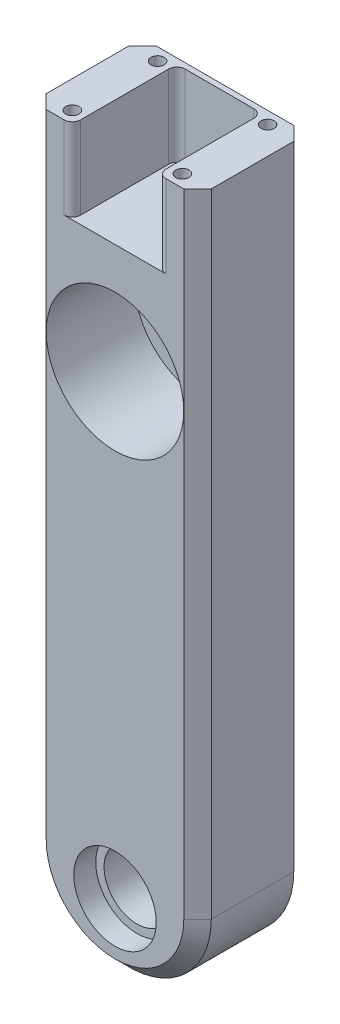
ISO-10303-21;
HEADER;
FILE_DESCRIPTION(('STEP AP214'),'2;1');
FILE_NAME('part.step','',(''),(''),'','','');
FILE_SCHEMA(('AUTOMOTIVE_DESIGN { 1 0 10303 214 1 1 1 1 }'));
ENDSEC;
DATA;
#1=APPLICATION_CONTEXT('core data for automotive mechanical design processes');
#2=APPLICATION_PROTOCOL_DEFINITION('international standard','automotive_design',2000,#1);
#3=PRODUCT_CONTEXT('',#1,'mechanical');
#4=PRODUCT('Part','Part','',(#3));
#5=PRODUCT_RELATED_PRODUCT_CATEGORY('part','',(#4));
#6=PRODUCT_DEFINITION_FORMATION('','',#4);
#7=PRODUCT_DEFINITION_CONTEXT('part definition',#1,'design');
#8=PRODUCT_DEFINITION('design','',#6,#7);
#9=PRODUCT_DEFINITION_SHAPE('','',#8);
#10=(LENGTH_UNIT() NAMED_UNIT(*) SI_UNIT(.MILLI.,.METRE.));
#11=(NAMED_UNIT(*) PLANE_ANGLE_UNIT() SI_UNIT($,.RADIAN.));
#12=(NAMED_UNIT(*) SI_UNIT($,.STERADIAN.) SOLID_ANGLE_UNIT());
#13=UNCERTAINTY_MEASURE_WITH_UNIT(LENGTH_MEASURE(1.E-05),#10,'distance_accuracy_value','');
#14=(GEOMETRIC_REPRESENTATION_CONTEXT(3) GLOBAL_UNCERTAINTY_ASSIGNED_CONTEXT((#13)) GLOBAL_UNIT_ASSIGNED_CONTEXT((#10,
#11,#12)) REPRESENTATION_CONTEXT('',''));
#15=CARTESIAN_POINT('',(0.,0.,0.));
#16=DIRECTION('',(0.,0.,1.));
#17=DIRECTION('',(1.,0.,0.));
#18=AXIS2_PLACEMENT_3D('',#15,#16,#17);
#19=CARTESIAN_POINT('',(0.,0.,10.));
#20=DIRECTION('',(0.,0.,1.));
#21=DIRECTION('',(1.,0.,0.));
#22=AXIS2_PLACEMENT_3D('',#19,#20,#21);
#23=PLANE('',#22);
#24=CARTESIAN_POINT('',(0.,0.,10.));
#25=DIRECTION('',(0.,0.,-1.));
#26=DIRECTION('',(-1.,0.,0.));
#27=AXIS2_PLACEMENT_3D('',#24,#25,#26);
#28=CIRCLE('',#27,12.5);
#29=CARTESIAN_POINT('',(-12.4999999999998,0.,10.));
#30=VERTEX_POINT('',#29);
#31=CARTESIAN_POINT('',(12.5000000000002,0.,10.));
#32=VERTEX_POINT('',#31);
#33=EDGE_CURVE('E417',#30,#32,#28,.T.);
#34=ORIENTED_EDGE('',*,*,#33,.T.);
#35=DIRECTION('',(0.,1.,0.));
#36=VECTOR('',#35,1.);
#37=CARTESIAN_POINT('',(12.5000000000002,35.,10.));
#38=LINE('',#37,#36);
#39=CARTESIAN_POINT('',(12.5000000000002,35.,10.));
#40=VERTEX_POINT('',#39);
#41=EDGE_CURVE('E338',#32,#40,#38,.T.);
#42=ORIENTED_EDGE('',*,*,#41,.T.);
#43=DIRECTION('',(1.,0.,0.));
#44=VECTOR('',#43,1.);
#45=CARTESIAN_POINT('',(15.0000000000002,35.,10.));
#46=LINE('',#45,#44);
#47=CARTESIAN_POINT('',(9.25,35.,10.));
#48=VERTEX_POINT('',#47);
#49=EDGE_CURVE('E545',#48,#40,#46,.T.);
#50=ORIENTED_EDGE('',*,*,#49,.F.);
#51=DIRECTION('',(0.,-1.,0.));
#52=VECTOR('',#51,1.);
#53=CARTESIAN_POINT('',(9.25,20.,10.));
#54=LINE('',#53,#52);
#55=CARTESIAN_POINT('',(9.25,20.,10.));
#56=VERTEX_POINT('',#55);
#57=EDGE_CURVE('E278',#48,#56,#54,.T.);
#58=ORIENTED_EDGE('',*,*,#57,.T.);
#59=DIRECTION('',(-1.,0.,0.));
#60=VECTOR('',#59,1.);
#61=CARTESIAN_POINT('',(0.,20.,10.));
#62=LINE('',#61,#60);
#63=CARTESIAN_POINT('',(-9.25,20.,10.));
#64=VERTEX_POINT('',#63);
#65=EDGE_CURVE('E255',#56,#64,#62,.T.);
#66=ORIENTED_EDGE('',*,*,#65,.T.);
#67=DIRECTION('',(0.,-1.,0.));
#68=VECTOR('',#67,1.);
#69=CARTESIAN_POINT('',(-9.25,35.,10.));
#70=LINE('',#69,#68);
#71=CARTESIAN_POINT('',(-9.25,35.,10.));
#72=VERTEX_POINT('',#71);
#73=EDGE_CURVE('E282',#64,#72,#70,.F.);
#74=ORIENTED_EDGE('',*,*,#73,.T.);
#75=DIRECTION('',(1.,0.,0.));
#76=VECTOR('',#75,1.);
#77=CARTESIAN_POINT('',(-14.9999999999998,35.,10.));
#78=LINE('',#77,#76);
#79=CARTESIAN_POINT('',(-12.4999999999998,35.,10.));
#80=VERTEX_POINT('',#79);
#81=EDGE_CURVE('E420',#80,#72,#78,.T.);
#82=ORIENTED_EDGE('',*,*,#81,.F.);
#83=DIRECTION('',(0.,-1.,0.));
#84=VECTOR('',#83,1.);
#85=CARTESIAN_POINT('',(-12.4999999999998,0.,10.));
#86=LINE('',#85,#84);
#87=EDGE_CURVE('E328',#80,#30,#86,.T.);
#88=ORIENTED_EDGE('',*,*,#87,.T.);
#89=EDGE_LOOP('',(#34,#42,#50,#58,#66,#74,#82,#88));
#90=FACE_BOUND('',#89,.T.);
#91=ADVANCED_FACE('F43',(#90),#23,.T.);
#92=CARTESIAN_POINT('',(0.,20.,10.));
#93=DIRECTION('',(0.,-1.,0.));
#94=DIRECTION('',(0.,0.,-1.));
#95=AXIS2_PLACEMENT_3D('',#92,#93,#94);
#96=PLANE('',#95);
#97=DIRECTION('',(0.,0.,1.));
#98=VECTOR('',#97,1.);
#99=CARTESIAN_POINT('',(7.75,20.,-10.));
#100=LINE('',#99,#98);
#101=CARTESIAN_POINT('',(7.75,20.,-7.5));
#102=VERTEX_POINT('',#101);
#103=CARTESIAN_POINT('',(7.75,20.,8.5));
#104=VERTEX_POINT('',#103);
#105=EDGE_CURVE('E564',#102,#104,#100,.T.);
#106=ORIENTED_EDGE('',*,*,#105,.F.);
#107=CARTESIAN_POINT('',(6.25,20.,-7.5));
#108=DIRECTION('',(0.,-1.,0.));
#109=DIRECTION('',(0.,0.,-1.));
#110=AXIS2_PLACEMENT_3D('',#107,#108,#109);
#111=CIRCLE('',#110,1.5);
#112=CARTESIAN_POINT('',(6.25,20.,-9.));
#113=VERTEX_POINT('',#112);
#114=EDGE_CURVE('E302',#102,#113,#111,.F.);
#115=ORIENTED_EDGE('',*,*,#114,.T.);
#116=DIRECTION('',(1.,0.,0.));
#117=VECTOR('',#116,1.);
#118=CARTESIAN_POINT('',(-7.75,20.,-9.));
#119=LINE('',#118,#117);
#120=CARTESIAN_POINT('',(-6.25,20.,-9.));
#121=VERTEX_POINT('',#120);
#122=EDGE_CURVE('E384',#121,#113,#119,.T.);
#123=ORIENTED_EDGE('',*,*,#122,.F.);
#124=CARTESIAN_POINT('',(-6.25,20.,-7.5));
#125=DIRECTION('',(0.,-1.,0.));
#126=DIRECTION('',(0.,0.,-1.));
#127=AXIS2_PLACEMENT_3D('',#124,#125,#126);
#128=CIRCLE('',#127,1.5);
#129=CARTESIAN_POINT('',(-7.75,20.,-7.5));
#130=VERTEX_POINT('',#129);
#131=EDGE_CURVE('E299',#121,#130,#128,.F.);
#132=ORIENTED_EDGE('',*,*,#131,.T.);
#133=DIRECTION('',(0.,0.,-1.));
#134=VECTOR('',#133,1.);
#135=CARTESIAN_POINT('',(-7.75,20.,-10.));
#136=LINE('',#135,#134);
#137=CARTESIAN_POINT('',(-7.75,20.,8.5));
#138=VERTEX_POINT('',#137);
#139=EDGE_CURVE('E424',#138,#130,#136,.T.);
#140=ORIENTED_EDGE('',*,*,#139,.F.);
#141=CARTESIAN_POINT('',(-9.25,20.,8.5));
#142=DIRECTION('',(0.,-1.,0.));
#143=DIRECTION('',(0.,0.,-1.));
#144=AXIS2_PLACEMENT_3D('',#141,#142,#143);
#145=CIRCLE('',#144,1.5);
#146=EDGE_CURVE('E312',#138,#64,#145,.T.);
#147=ORIENTED_EDGE('',*,*,#146,.T.);
#148=ORIENTED_EDGE('',*,*,#65,.F.);
#149=CARTESIAN_POINT('',(9.25,20.,8.5));
#150=DIRECTION('',(0.,-1.,0.));
#151=DIRECTION('',(0.,0.,-1.));
#152=AXIS2_PLACEMENT_3D('',#149,#150,#151);
#153=CIRCLE('',#152,1.5);
#154=EDGE_CURVE('E316',#56,#104,#153,.T.);
#155=ORIENTED_EDGE('',*,*,#154,.T.);
#156=EDGE_LOOP('',(#106,#115,#123,#132,#140,#147,#148,#155));
#157=FACE_BOUND('',#156,.T.);
#158=ADVANCED_FACE('F503',(#157),#96,.F.);
#159=CARTESIAN_POINT('',(-7.75,35.,-10.));
#160=DIRECTION('',(-1.,0.,0.));
#161=DIRECTION('',(0.,0.,1.));
#162=AXIS2_PLACEMENT_3D('',#159,#160,#161);
#163=PLANE('',#162);
#164=DIRECTION('',(0.,0.,-1.));
#165=VECTOR('',#164,1.);
#166=CARTESIAN_POINT('',(-7.75,35.,-10.));
#167=LINE('',#166,#165);
#168=CARTESIAN_POINT('',(-7.75,35.,8.5));
#169=VERTEX_POINT('',#168);
#170=CARTESIAN_POINT('',(-7.75,35.,-7.5));
#171=VERTEX_POINT('',#170);
#172=EDGE_CURVE('E412',#169,#171,#167,.T.);
#173=ORIENTED_EDGE('',*,*,#172,.F.);
#174=DIRECTION('',(0.,-1.,0.));
#175=VECTOR('',#174,1.);
#176=CARTESIAN_POINT('',(-7.75,20.,8.5));
#177=LINE('',#176,#175);
#178=EDGE_CURVE('E274',#169,#138,#177,.T.);
#179=ORIENTED_EDGE('',*,*,#178,.T.);
#180=ORIENTED_EDGE('',*,*,#139,.T.);
#181=DIRECTION('',(0.,-1.,0.));
#182=VECTOR('',#181,1.);
#183=CARTESIAN_POINT('',(-7.75,35.,-7.5));
#184=LINE('',#183,#182);
#185=EDGE_CURVE('E208',#130,#171,#184,.F.);
#186=ORIENTED_EDGE('',*,*,#185,.T.);
#187=EDGE_LOOP('',(#173,#179,#180,#186));
#188=FACE_BOUND('',#187,.T.);
#189=ADVANCED_FACE('F510',(#188),#163,.F.);
#190=CARTESIAN_POINT('',(7.75,35.,-10.));
#191=DIRECTION('',(1.,0.,0.));
#192=DIRECTION('',(0.,0.,-1.));
#193=AXIS2_PLACEMENT_3D('',#190,#191,#192);
#194=PLANE('',#193);
#195=ORIENTED_EDGE('',*,*,#105,.T.);
#196=DIRECTION('',(0.,-1.,0.));
#197=VECTOR('',#196,1.);
#198=CARTESIAN_POINT('',(7.75,35.,8.5));
#199=LINE('',#198,#197);
#200=CARTESIAN_POINT('',(7.75,35.,8.5));
#201=VERTEX_POINT('',#200);
#202=EDGE_CURVE('E296',#104,#201,#199,.F.);
#203=ORIENTED_EDGE('',*,*,#202,.T.);
#204=DIRECTION('',(0.,0.,1.));
#205=VECTOR('',#204,1.);
#206=CARTESIAN_POINT('',(7.75,35.,-10.));
#207=LINE('',#206,#205);
#208=CARTESIAN_POINT('',(7.75,35.,-7.5));
#209=VERTEX_POINT('',#208);
#210=EDGE_CURVE('E553',#209,#201,#207,.T.);
#211=ORIENTED_EDGE('',*,*,#210,.F.);
#212=DIRECTION('',(0.,-1.,0.));
#213=VECTOR('',#212,1.);
#214=CARTESIAN_POINT('',(7.75,20.,-7.5));
#215=LINE('',#214,#213);
#216=EDGE_CURVE('E292',#209,#102,#215,.T.);
#217=ORIENTED_EDGE('',*,*,#216,.T.);
#218=EDGE_LOOP('',(#195,#203,#211,#217));
#219=FACE_BOUND('',#218,.T.);
#220=ADVANCED_FACE('F792',(#219),#194,.F.);
#221=CARTESIAN_POINT('',(1.90584371601527E-13,-83.,10.));
#222=DIRECTION('',(0.,0.,-1.));
#223=DIRECTION('',(-1.,0.,0.));
#224=AXIS2_PLACEMENT_3D('',#221,#222,#223);
#225=CYLINDRICAL_SURFACE('',#224,7.50000000000001);
#226=CARTESIAN_POINT('',(1.90584371601527E-13,-83.,-10.));
#227=DIRECTION('',(0.,0.,1.));
#228=DIRECTION('',(1.,0.,0.));
#229=AXIS2_PLACEMENT_3D('',#226,#227,#228);
#230=CIRCLE('',#229,7.50000000000001);
#231=CARTESIAN_POINT('',(7.5000000000002,-83.,-10.));
#232=VERTEX_POINT('',#231);
#233=EDGE_CURVE('E241',#232,#232,#230,.T.);
#234=ORIENTED_EDGE('',*,*,#233,.F.);
#235=EDGE_LOOP('',(#234));
#236=FACE_BOUND('',#235,.T.);
#237=CARTESIAN_POINT('',(1.90584371601527E-13,-83.,-6.));
#238=DIRECTION('',(0.,0.,1.));
#239=DIRECTION('',(1.,0.,0.));
#240=AXIS2_PLACEMENT_3D('',#237,#238,#239);
#241=CIRCLE('',#240,7.50000000000001);
#242=CARTESIAN_POINT('',(7.5000000000002,-83.,-6.));
#243=VERTEX_POINT('',#242);
#244=EDGE_CURVE('E242',#243,#243,#241,.T.);
#245=ORIENTED_EDGE('',*,*,#244,.T.);
#246=EDGE_LOOP('',(#245));
#247=FACE_BOUND('',#246,.T.);
#248=ADVANCED_FACE('F528',(#236,#247),#225,.F.);
#249=CARTESIAN_POINT('',(-14.9999999999998,0.,10.));
#250=DIRECTION('',(-1.,0.,0.));
#251=DIRECTION('',(0.,-1.,0.));
#252=AXIS2_PLACEMENT_3D('',#249,#250,#251);
#253=PLANE('',#252);
#254=DIRECTION('',(0.,0.,-1.));
#255=VECTOR('',#254,1.);
#256=CARTESIAN_POINT('',(-14.9999999999998,-80.,10.));
#257=LINE('',#256,#255);
#258=CARTESIAN_POINT('',(-14.9999999999998,-80.,7.5));
#259=VERTEX_POINT('',#258);
#260=CARTESIAN_POINT('',(-14.9999999999998,-80.,-7.50000000000001));
#261=VERTEX_POINT('',#260);
#262=EDGE_CURVE('E265',#259,#261,#257,.T.);
#263=ORIENTED_EDGE('',*,*,#262,.F.);
#264=DIRECTION('',(0.,1.,0.));
#265=VECTOR('',#264,1.);
#266=CARTESIAN_POINT('',(-14.9999999999998,0.,7.5));
#267=LINE('',#266,#265);
#268=CARTESIAN_POINT('',(-14.9999999999998,35.,7.5));
#269=VERTEX_POINT('',#268);
#270=EDGE_CURVE('E369',#259,#269,#267,.T.);
#271=ORIENTED_EDGE('',*,*,#270,.T.);
#272=DIRECTION('',(0.,0.,1.));
#273=VECTOR('',#272,1.);
#274=CARTESIAN_POINT('',(-14.9999999999998,35.,-10.));
#275=LINE('',#274,#273);
#276=CARTESIAN_POINT('',(-14.9999999999998,35.,-7.50000000000001));
#277=VERTEX_POINT('',#276);
#278=EDGE_CURVE('E428',#277,#269,#275,.T.);
#279=ORIENTED_EDGE('',*,*,#278,.F.);
#280=DIRECTION('',(0.,-1.,0.));
#281=VECTOR('',#280,1.);
#282=CARTESIAN_POINT('',(-14.9999999999998,-80.,-7.50000000000001));
#283=LINE('',#282,#281);
#284=EDGE_CURVE('E366',#277,#261,#283,.T.);
#285=ORIENTED_EDGE('',*,*,#284,.T.);
#286=EDGE_LOOP('',(#263,#271,#279,#285));
#287=FACE_BOUND('',#286,.T.);
#288=ADVANCED_FACE('F853',(#287),#253,.T.);
#289=CARTESIAN_POINT('',(1.90819582357449E-13,-80.,10.));
#290=DIRECTION('',(0.,0.,-1.));
#291=DIRECTION('',(-1.,0.,0.));
#292=AXIS2_PLACEMENT_3D('',#289,#290,#291);
#293=CYLINDRICAL_SURFACE('',#292,15.);
#294=DIRECTION('',(0.,0.,-1.));
#295=VECTOR('',#294,1.);
#296=CARTESIAN_POINT('',(15.0000000000002,-80.,10.));
#297=LINE('',#296,#295);
#298=CARTESIAN_POINT('',(15.0000000000002,-80.,7.5));
#299=VERTEX_POINT('',#298);
#300=CARTESIAN_POINT('',(15.0000000000002,-80.,-7.50000000000001));
#301=VERTEX_POINT('',#300);
#302=EDGE_CURVE('E258',#299,#301,#297,.T.);
#303=ORIENTED_EDGE('',*,*,#302,.F.);
#304=CARTESIAN_POINT('',(1.90819582357449E-13,-80.,7.5));
#305=DIRECTION('',(0.,0.,1.));
#306=DIRECTION('',(1.,0.,0.));
#307=AXIS2_PLACEMENT_3D('',#304,#305,#306);
#308=CIRCLE('',#307,15.);
#309=EDGE_CURVE('E363',#299,#259,#308,.F.);
#310=ORIENTED_EDGE('',*,*,#309,.T.);
#311=ORIENTED_EDGE('',*,*,#262,.T.);
#312=CARTESIAN_POINT('',(1.90819582357449E-13,-80.,-7.50000000000001));
#313=DIRECTION('',(0.,0.,1.));
#314=DIRECTION('',(1.,0.,0.));
#315=AXIS2_PLACEMENT_3D('',#312,#313,#314);
#316=CIRCLE('',#315,15.);
#317=EDGE_CURVE('E360',#261,#301,#316,.T.);
#318=ORIENTED_EDGE('',*,*,#317,.T.);
#319=EDGE_LOOP('',(#303,#310,#311,#318));
#320=FACE_BOUND('',#319,.T.);
#321=ADVANCED_FACE('F857',(#320),#293,.T.);
#322=CARTESIAN_POINT('',(15.0000000000002,0.,10.));
#323=DIRECTION('',(-1.,0.,0.));
#324=DIRECTION('',(0.,0.,1.));
#325=AXIS2_PLACEMENT_3D('',#322,#323,#324);
#326=PLANE('',#325);
#327=DIRECTION('',(0.,0.,-1.));
#328=VECTOR('',#327,1.);
#329=CARTESIAN_POINT('',(15.0000000000002,35.,-10.));
#330=LINE('',#329,#328);
#331=CARTESIAN_POINT('',(15.0000000000002,35.,7.5));
#332=VERTEX_POINT('',#331);
#333=CARTESIAN_POINT('',(15.0000000000002,35.,-7.5));
#334=VERTEX_POINT('',#333);
#335=EDGE_CURVE('E560',#332,#334,#330,.T.);
#336=ORIENTED_EDGE('',*,*,#335,.F.);
#337=DIRECTION('',(0.,-1.,0.));
#338=VECTOR('',#337,1.);
#339=CARTESIAN_POINT('',(15.0000000000002,-80.,7.5));
#340=LINE('',#339,#338);
#341=EDGE_CURVE('E357',#332,#299,#340,.T.);
#342=ORIENTED_EDGE('',*,*,#341,.T.);
#343=ORIENTED_EDGE('',*,*,#302,.T.);
#344=DIRECTION('',(0.,1.,0.));
#345=VECTOR('',#344,1.);
#346=CARTESIAN_POINT('',(15.0000000000002,0.,-7.5));
#347=LINE('',#346,#345);
#348=EDGE_CURVE('E353',#301,#334,#347,.T.);
#349=ORIENTED_EDGE('',*,*,#348,.T.);
#350=EDGE_LOOP('',(#336,#342,#343,#349));
#351=FACE_BOUND('',#350,.T.);
#352=ADVANCED_FACE('F525',(#351),#326,.F.);
#353=CARTESIAN_POINT('',(1.90584371601527E-13,-83.,6.));
#354=DIRECTION('',(0.,0.,1.));
#355=DIRECTION('',(1.,0.,0.));
#356=AXIS2_PLACEMENT_3D('',#353,#354,#355);
#357=CIRCLE('',#356,7.50000000000001);
#358=CARTESIAN_POINT('',(7.5000000000002,-83.,6.));
#359=VERTEX_POINT('',#358);
#360=EDGE_CURVE('E209',#359,#359,#357,.T.);
#361=ORIENTED_EDGE('',*,*,#360,.F.);
#362=EDGE_LOOP('',(#361));
#363=FACE_BOUND('',#362,.T.);
#364=CARTESIAN_POINT('',(1.90584371601527E-13,-83.,10.));
#365=DIRECTION('',(0.,0.,1.));
#366=DIRECTION('',(1.,0.,0.));
#367=AXIS2_PLACEMENT_3D('',#364,#365,#366);
#368=CIRCLE('',#367,7.50000000000001);
#369=CARTESIAN_POINT('',(7.5000000000002,-83.,10.));
#370=VERTEX_POINT('',#369);
#371=EDGE_CURVE('E251',#370,#370,#368,.T.);
#372=ORIENTED_EDGE('',*,*,#371,.T.);
#373=EDGE_LOOP('',(#372));
#374=FACE_BOUND('',#373,.T.);
#375=ADVANCED_FACE('F518',(#363,#374),#225,.F.);
#376=ORIENTED_EDGE('',*,*,#371,.F.);
#377=EDGE_LOOP('',(#376));
#378=FACE_BOUND('',#377,.T.);
#379=CARTESIAN_POINT('',(1.90819582357449E-13,-80.,10.));
#380=DIRECTION('',(0.,0.,1.));
#381=DIRECTION('',(1.,0.,0.));
#382=AXIS2_PLACEMENT_3D('',#379,#380,#381);
#383=CIRCLE('',#382,12.5);
#384=CARTESIAN_POINT('',(-12.4999999999998,-80.,10.));
#385=VERTEX_POINT('',#384);
#386=CARTESIAN_POINT('',(12.5000000000002,-80.,10.));
#387=VERTEX_POINT('',#386);
#388=EDGE_CURVE('E331',#385,#387,#383,.T.);
#389=ORIENTED_EDGE('',*,*,#388,.T.);
#390=DIRECTION('',(0.,1.,0.));
#391=VECTOR('',#390,1.);
#392=CARTESIAN_POINT('',(12.5000000000002,35.,10.));
#393=LINE('',#392,#391);
#394=EDGE_CURVE('E334',#387,#32,#393,.T.);
#395=ORIENTED_EDGE('',*,*,#394,.T.);
#396=EDGE_CURVE('E411',#32,#30,#28,.T.);
#397=ORIENTED_EDGE('',*,*,#396,.T.);
#398=DIRECTION('',(0.,-1.,0.));
#399=VECTOR('',#398,1.);
#400=CARTESIAN_POINT('',(-12.4999999999998,0.,10.));
#401=LINE('',#400,#399);
#402=EDGE_CURVE('E325',#30,#385,#401,.T.);
#403=ORIENTED_EDGE('',*,*,#402,.T.);
#404=EDGE_LOOP('',(#389,#395,#397,#403));
#405=FACE_BOUND('',#404,.T.);
#406=ADVANCED_FACE('F506',(#378,#405),#23,.T.);
#407=CARTESIAN_POINT('',(0.,0.,-10.));
#408=DIRECTION('',(0.,0.,1.));
#409=DIRECTION('',(1.,0.,0.));
#410=AXIS2_PLACEMENT_3D('',#407,#408,#409);
#411=PLANE('',#410);
#412=DIRECTION('',(0.866025403784439,-0.5,0.));
#413=VECTOR('',#412,1.);
#414=CARTESIAN_POINT('',(0.,6.,-10.));
#415=LINE('',#414,#413);
#416=CARTESIAN_POINT('',(0.,6.,-10.));
#417=VERTEX_POINT('',#416);
#418=CARTESIAN_POINT('',(5.19615242270663,3.,-10.));
#419=VERTEX_POINT('',#418);
#420=EDGE_CURVE('E224',#417,#419,#415,.T.);
#421=ORIENTED_EDGE('',*,*,#420,.F.);
#422=DIRECTION('',(0.866025403784439,0.5,0.));
#423=VECTOR('',#422,1.);
#424=CARTESIAN_POINT('',(-5.19615242270663,3.,-10.));
#425=LINE('',#424,#423);
#426=CARTESIAN_POINT('',(-5.19615242270663,3.,-10.));
#427=VERTEX_POINT('',#426);
#428=EDGE_CURVE('E447',#427,#417,#425,.T.);
#429=ORIENTED_EDGE('',*,*,#428,.F.);
#430=DIRECTION('',(0.,1.,0.));
#431=VECTOR('',#430,1.);
#432=CARTESIAN_POINT('',(-5.19615242270663,-3.,-10.));
#433=LINE('',#432,#431);
#434=CARTESIAN_POINT('',(-5.19615242270663,-3.,-10.));
#435=VERTEX_POINT('',#434);
#436=EDGE_CURVE('E233',#435,#427,#433,.T.);
#437=ORIENTED_EDGE('',*,*,#436,.F.);
#438=DIRECTION('',(-0.866025403784439,0.5,0.));
#439=VECTOR('',#438,1.);
#440=CARTESIAN_POINT('',(0.,-6.,-10.));
#441=LINE('',#440,#439);
#442=CARTESIAN_POINT('',(0.,-6.,-10.));
#443=VERTEX_POINT('',#442);
#444=EDGE_CURVE('E460',#443,#435,#441,.T.);
#445=ORIENTED_EDGE('',*,*,#444,.F.);
#446=DIRECTION('',(-0.866025403784439,-0.5,0.));
#447=VECTOR('',#446,1.);
#448=CARTESIAN_POINT('',(5.19615242270663,-3.,-10.));
#449=LINE('',#448,#447);
#450=CARTESIAN_POINT('',(5.19615242270663,-3.,-10.));
#451=VERTEX_POINT('',#450);
#452=EDGE_CURVE('E456',#451,#443,#449,.T.);
#453=ORIENTED_EDGE('',*,*,#452,.F.);
#454=DIRECTION('',(0.,-1.,0.));
#455=VECTOR('',#454,1.);
#456=CARTESIAN_POINT('',(5.19615242270663,3.,-10.));
#457=LINE('',#456,#455);
#458=EDGE_CURVE('E453',#419,#451,#457,.T.);
#459=ORIENTED_EDGE('',*,*,#458,.F.);
#460=EDGE_LOOP('',(#421,#429,#437,#445,#453,#459));
#461=FACE_BOUND('',#460,.T.);
#462=ORIENTED_EDGE('',*,*,#233,.T.);
#463=EDGE_LOOP('',(#462));
#464=FACE_BOUND('',#463,.T.);
#465=DIRECTION('',(-1.,0.,0.));
#466=VECTOR('',#465,1.);
#467=CARTESIAN_POINT('',(-14.9999999999998,35.,-10.));
#468=LINE('',#467,#466);
#469=CARTESIAN_POINT('',(12.5000000000002,35.,-10.));
#470=VERTEX_POINT('',#469);
#471=CARTESIAN_POINT('',(-12.4999999999998,35.,-10.));
#472=VERTEX_POINT('',#471);
#473=EDGE_CURVE('E402',#470,#472,#468,.T.);
#474=ORIENTED_EDGE('',*,*,#473,.F.);
#475=DIRECTION('',(0.,-1.,0.));
#476=VECTOR('',#475,1.);
#477=CARTESIAN_POINT('',(12.5000000000002,0.,-10.));
#478=LINE('',#477,#476);
#479=CARTESIAN_POINT('',(12.5000000000002,-80.,-10.));
#480=VERTEX_POINT('',#479);
#481=EDGE_CURVE('E11',#470,#480,#478,.T.);
#482=ORIENTED_EDGE('',*,*,#481,.T.);
#483=CARTESIAN_POINT('',(1.90819582357449E-13,-80.,-10.));
#484=DIRECTION('',(0.,0.,1.));
#485=DIRECTION('',(1.,0.,0.));
#486=AXIS2_PLACEMENT_3D('',#483,#484,#485);
#487=CIRCLE('',#486,12.5);
#488=CARTESIAN_POINT('',(-12.4999999999998,-80.,-10.));
#489=VERTEX_POINT('',#488);
#490=EDGE_CURVE('E54',#480,#489,#487,.F.);
#491=ORIENTED_EDGE('',*,*,#490,.T.);
#492=DIRECTION('',(0.,1.,0.));
#493=VECTOR('',#492,1.);
#494=CARTESIAN_POINT('',(-12.4999999999998,35.,-10.));
#495=LINE('',#494,#493);
#496=EDGE_CURVE('E372',#489,#472,#495,.T.);
#497=ORIENTED_EDGE('',*,*,#496,.T.);
#498=EDGE_LOOP('',(#474,#482,#491,#497));
#499=FACE_BOUND('',#498,.T.);
#500=ADVANCED_FACE('F401',(#461,#464,#499),#411,.F.);
#501=CARTESIAN_POINT('',(1.90584371601527E-13,-83.,6.));
#502=DIRECTION('',(0.,0.,-1.));
#503=DIRECTION('',(-1.,0.,0.));
#504=AXIS2_PLACEMENT_3D('',#501,#502,#503);
#505=CYLINDRICAL_SURFACE('',#504,6.00000000000001);
#506=CARTESIAN_POINT('',(1.90584371601527E-13,-83.,6.));
#507=DIRECTION('',(0.,0.,1.));
#508=DIRECTION('',(1.,0.,0.));
#509=AXIS2_PLACEMENT_3D('',#506,#507,#508);
#510=CIRCLE('',#509,6.00000000000001);
#511=CARTESIAN_POINT('',(6.0000000000002,-83.,6.));
#512=VERTEX_POINT('',#511);
#513=EDGE_CURVE('E237',#512,#512,#510,.T.);
#514=ORIENTED_EDGE('',*,*,#513,.T.);
#515=EDGE_LOOP('',(#514));
#516=FACE_BOUND('',#515,.T.);
#517=CARTESIAN_POINT('',(1.90584371601527E-13,-83.,-6.));
#518=DIRECTION('',(0.,0.,1.));
#519=DIRECTION('',(1.,0.,0.));
#520=AXIS2_PLACEMENT_3D('',#517,#518,#519);
#521=CIRCLE('',#520,6.00000000000001);
#522=CARTESIAN_POINT('',(6.0000000000002,-83.,-6.));
#523=VERTEX_POINT('',#522);
#524=EDGE_CURVE('E243',#523,#523,#521,.T.);
#525=ORIENTED_EDGE('',*,*,#524,.F.);
#526=EDGE_LOOP('',(#525));
#527=FACE_BOUND('',#526,.T.);
#528=ADVANCED_FACE('F524',(#516,#527),#505,.F.);
#529=CARTESIAN_POINT('',(0.,0.,6.));
#530=DIRECTION('',(0.,0.,1.));
#531=DIRECTION('',(1.,0.,0.));
#532=AXIS2_PLACEMENT_3D('',#529,#530,#531);
#533=PLANE('',#532);
#534=ORIENTED_EDGE('',*,*,#513,.F.);
#535=EDGE_LOOP('',(#534));
#536=FACE_BOUND('',#535,.T.);
#537=ORIENTED_EDGE('',*,*,#360,.T.);
#538=EDGE_LOOP('',(#537));
#539=FACE_BOUND('',#538,.T.);
#540=ADVANCED_FACE('F497',(#536,#539),#533,.T.);
#541=CARTESIAN_POINT('',(0.,0.,-6.));
#542=DIRECTION('',(0.,0.,1.));
#543=DIRECTION('',(1.,0.,0.));
#544=AXIS2_PLACEMENT_3D('',#541,#542,#543);
#545=PLANE('',#544);
#546=ORIENTED_EDGE('',*,*,#524,.T.);
#547=EDGE_LOOP('',(#546));
#548=FACE_BOUND('',#547,.T.);
#549=ORIENTED_EDGE('',*,*,#244,.F.);
#550=EDGE_LOOP('',(#549));
#551=FACE_BOUND('',#550,.T.);
#552=ADVANCED_FACE('F490',(#548,#551),#545,.F.);
#553=CARTESIAN_POINT('',(-5.19615242270663,3.,-4.));
#554=DIRECTION('',(-0.5,0.866025403784439,0.));
#555=DIRECTION('',(-0.866025403784439,-0.5,0.));
#556=AXIS2_PLACEMENT_3D('',#553,#554,#555);
#557=PLANE('',#556);
#558=DIRECTION('',(0.,0.,-1.));
#559=VECTOR('',#558,1.);
#560=CARTESIAN_POINT('',(0.,6.,-4.));
#561=LINE('',#560,#559);
#562=CARTESIAN_POINT('',(0.,6.,-6.));
#563=VERTEX_POINT('',#562);
#564=EDGE_CURVE('E227',#563,#417,#561,.T.);
#565=ORIENTED_EDGE('',*,*,#564,.F.);
#566=DIRECTION('',(-0.866025403784439,-0.5,0.));
#567=VECTOR('',#566,1.);
#568=CARTESIAN_POINT('',(-5.19615242270663,3.,-6.));
#569=LINE('',#568,#567);
#570=CARTESIAN_POINT('',(-5.19615242270663,3.,-6.));
#571=VERTEX_POINT('',#570);
#572=EDGE_CURVE('E203',#563,#571,#569,.T.);
#573=ORIENTED_EDGE('',*,*,#572,.T.);
#574=DIRECTION('',(0.,0.,-1.));
#575=VECTOR('',#574,1.);
#576=CARTESIAN_POINT('',(-5.19615242270663,3.,-4.));
#577=LINE('',#576,#575);
#578=EDGE_CURVE('E247',#571,#427,#577,.T.);
#579=ORIENTED_EDGE('',*,*,#578,.T.);
#580=ORIENTED_EDGE('',*,*,#428,.T.);
#581=EDGE_LOOP('',(#565,#573,#579,#580));
#582=FACE_BOUND('',#581,.T.);
#583=ADVANCED_FACE('F488',(#582),#557,.F.);
#584=CARTESIAN_POINT('',(-5.19615242270663,-3.,-4.));
#585=DIRECTION('',(-1.,0.,0.));
#586=DIRECTION('',(0.,-1.,0.));
#587=AXIS2_PLACEMENT_3D('',#584,#585,#586);
#588=PLANE('',#587);
#589=ORIENTED_EDGE('',*,*,#578,.F.);
#590=DIRECTION('',(0.,-1.,0.));
#591=VECTOR('',#590,1.);
#592=CARTESIAN_POINT('',(-5.19615242270663,-3.,-6.));
#593=LINE('',#592,#591);
#594=CARTESIAN_POINT('',(-5.19615242270663,-3.,-6.));
#595=VERTEX_POINT('',#594);
#596=EDGE_CURVE('E441',#571,#595,#593,.T.);
#597=ORIENTED_EDGE('',*,*,#596,.T.);
#598=DIRECTION('',(0.,0.,-1.));
#599=VECTOR('',#598,1.);
#600=CARTESIAN_POINT('',(-5.19615242270663,-3.,-4.));
#601=LINE('',#600,#599);
#602=EDGE_CURVE('E469',#595,#435,#601,.T.);
#603=ORIENTED_EDGE('',*,*,#602,.T.);
#604=ORIENTED_EDGE('',*,*,#436,.T.);
#605=EDGE_LOOP('',(#589,#597,#603,#604));
#606=FACE_BOUND('',#605,.T.);
#607=ADVANCED_FACE('F486',(#606),#588,.F.);
#608=CARTESIAN_POINT('',(0.,-6.,-4.));
#609=DIRECTION('',(-0.5,-0.866025403784439,0.));
#610=DIRECTION('',(0.866025403784439,-0.5,0.));
#611=AXIS2_PLACEMENT_3D('',#608,#609,#610);
#612=PLANE('',#611);
#613=ORIENTED_EDGE('',*,*,#602,.F.);
#614=DIRECTION('',(0.866025403784439,-0.5,0.));
#615=VECTOR('',#614,1.);
#616=CARTESIAN_POINT('',(0.,-6.,-6.));
#617=LINE('',#616,#615);
#618=CARTESIAN_POINT('',(0.,-6.,-6.));
#619=VERTEX_POINT('',#618);
#620=EDGE_CURVE('E437',#595,#619,#617,.T.);
#621=ORIENTED_EDGE('',*,*,#620,.T.);
#622=DIRECTION('',(0.,0.,-1.));
#623=VECTOR('',#622,1.);
#624=CARTESIAN_POINT('',(0.,-6.,-4.));
#625=LINE('',#624,#623);
#626=EDGE_CURVE('E231',#619,#443,#625,.T.);
#627=ORIENTED_EDGE('',*,*,#626,.T.);
#628=ORIENTED_EDGE('',*,*,#444,.T.);
#629=EDGE_LOOP('',(#613,#621,#627,#628));
#630=FACE_BOUND('',#629,.T.);
#631=ADVANCED_FACE('F475',(#630),#612,.F.);
#632=CARTESIAN_POINT('',(5.19615242270663,-3.,-4.));
#633=DIRECTION('',(0.5,-0.866025403784439,0.));
#634=DIRECTION('',(0.866025403784439,0.5,0.));
#635=AXIS2_PLACEMENT_3D('',#632,#633,#634);
#636=PLANE('',#635);
#637=ORIENTED_EDGE('',*,*,#626,.F.);
#638=DIRECTION('',(0.866025403784439,0.5,0.));
#639=VECTOR('',#638,1.);
#640=CARTESIAN_POINT('',(5.19615242270663,-3.,-6.));
#641=LINE('',#640,#639);
#642=CARTESIAN_POINT('',(5.19615242270663,-3.,-6.));
#643=VERTEX_POINT('',#642);
#644=EDGE_CURVE('E219',#619,#643,#641,.T.);
#645=ORIENTED_EDGE('',*,*,#644,.T.);
#646=DIRECTION('',(0.,0.,-1.));
#647=VECTOR('',#646,1.);
#648=CARTESIAN_POINT('',(5.19615242270663,-3.,-4.));
#649=LINE('',#648,#647);
#650=EDGE_CURVE('E217',#643,#451,#649,.T.);
#651=ORIENTED_EDGE('',*,*,#650,.T.);
#652=ORIENTED_EDGE('',*,*,#452,.T.);
#653=EDGE_LOOP('',(#637,#645,#651,#652));
#654=FACE_BOUND('',#653,.T.);
#655=ADVANCED_FACE('F480',(#654),#636,.F.);
#656=CARTESIAN_POINT('',(5.19615242270663,3.,-4.));
#657=DIRECTION('',(1.,0.,0.));
#658=DIRECTION('',(0.,1.,0.));
#659=AXIS2_PLACEMENT_3D('',#656,#657,#658);
#660=PLANE('',#659);
#661=ORIENTED_EDGE('',*,*,#650,.F.);
#662=DIRECTION('',(0.,1.,0.));
#663=VECTOR('',#662,1.);
#664=CARTESIAN_POINT('',(5.19615242270663,3.,-6.));
#665=LINE('',#664,#663);
#666=CARTESIAN_POINT('',(5.19615242270663,3.,-6.));
#667=VERTEX_POINT('',#666);
#668=EDGE_CURVE('E200',#643,#667,#665,.T.);
#669=ORIENTED_EDGE('',*,*,#668,.T.);
#670=DIRECTION('',(0.,0.,-1.));
#671=VECTOR('',#670,1.);
#672=CARTESIAN_POINT('',(5.19615242270663,3.,-4.));
#673=LINE('',#672,#671);
#674=EDGE_CURVE('E215',#667,#419,#673,.T.);
#675=ORIENTED_EDGE('',*,*,#674,.T.);
#676=ORIENTED_EDGE('',*,*,#458,.T.);
#677=EDGE_LOOP('',(#661,#669,#675,#676));
#678=FACE_BOUND('',#677,.T.);
#679=ADVANCED_FACE('F213',(#678),#660,.F.);
#680=CARTESIAN_POINT('',(0.,6.,-4.));
#681=DIRECTION('',(0.5,0.866025403784439,0.));
#682=DIRECTION('',(-0.866025403784439,0.5,0.));
#683=AXIS2_PLACEMENT_3D('',#680,#681,#682);
#684=PLANE('',#683);
#685=ORIENTED_EDGE('',*,*,#674,.F.);
#686=DIRECTION('',(-0.866025403784439,0.5,0.));
#687=VECTOR('',#686,1.);
#688=CARTESIAN_POINT('',(0.,6.,-6.));
#689=LINE('',#688,#687);
#690=EDGE_CURVE('E197',#667,#563,#689,.T.);
#691=ORIENTED_EDGE('',*,*,#690,.T.);
#692=ORIENTED_EDGE('',*,*,#564,.T.);
#693=ORIENTED_EDGE('',*,*,#420,.T.);
#694=EDGE_LOOP('',(#685,#691,#692,#693));
#695=FACE_BOUND('',#694,.T.);
#696=ADVANCED_FACE('F222',(#695),#684,.F.);
#697=CARTESIAN_POINT('',(0.,0.,-6.));
#698=DIRECTION('',(0.,0.,-1.));
#699=DIRECTION('',(-1.,0.,0.));
#700=AXIS2_PLACEMENT_3D('',#697,#698,#699);
#701=PLANE('',#700);
#702=CARTESIAN_POINT('',(0.,0.,-6.));
#703=DIRECTION('',(0.,0.,-1.));
#704=DIRECTION('',(-1.,0.,0.));
#705=AXIS2_PLACEMENT_3D('',#702,#703,#704);
#706=CIRCLE('',#705,12.5);
#707=CARTESIAN_POINT('',(-12.5,0.,-6.));
#708=VERTEX_POINT('',#707);
#709=EDGE_CURVE('E220',#708,#708,#706,.T.);
#710=ORIENTED_EDGE('',*,*,#709,.F.);
#711=EDGE_LOOP('',(#710));
#712=FACE_BOUND('',#711,.T.);
#713=ORIENTED_EDGE('',*,*,#690,.F.);
#714=ORIENTED_EDGE('',*,*,#668,.F.);
#715=ORIENTED_EDGE('',*,*,#644,.F.);
#716=ORIENTED_EDGE('',*,*,#620,.F.);
#717=ORIENTED_EDGE('',*,*,#596,.F.);
#718=ORIENTED_EDGE('',*,*,#572,.F.);
#719=EDGE_LOOP('',(#713,#714,#715,#716,#717,#718));
#720=FACE_BOUND('',#719,.T.);
#721=ADVANCED_FACE('F199',(#712,#720),#701,.F.);
#722=CARTESIAN_POINT('',(0.,0.,-6.));
#723=DIRECTION('',(0.,0.,1.));
#724=DIRECTION('',(1.,0.,0.));
#725=AXIS2_PLACEMENT_3D('',#722,#723,#724);
#726=CYLINDRICAL_SURFACE('',#725,12.5);
#727=ORIENTED_EDGE('',*,*,#709,.T.);
#728=EDGE_LOOP('',(#727));
#729=FACE_BOUND('',#728,.T.);
#730=ORIENTED_EDGE('',*,*,#33,.F.);
#731=ORIENTED_EDGE('',*,*,#396,.F.);
#732=EDGE_LOOP('',(#730,#731));
#733=FACE_BOUND('',#732,.T.);
#734=ADVANCED_FACE('F669',(#729,#733),#726,.F.);
#735=CARTESIAN_POINT('',(0.,35.,0.));
#736=DIRECTION('',(0.,1.,0.));
#737=DIRECTION('',(0.,0.,1.));
#738=AXIS2_PLACEMENT_3D('',#735,#736,#737);
#739=PLANE('',#738);
#740=CARTESIAN_POINT('',(-10.,35.,7.75));
#741=DIRECTION('',(0.,1.,0.));
#742=DIRECTION('',(0.,0.,1.));
#743=AXIS2_PLACEMENT_3D('',#740,#741,#742);
#744=CIRCLE('',#743,1.2);
#745=CARTESIAN_POINT('',(-10.,35.,8.95));
#746=VERTEX_POINT('',#745);
#747=EDGE_CURVE('E429',#746,#746,#744,.T.);
#748=ORIENTED_EDGE('',*,*,#747,.F.);
#749=EDGE_LOOP('',(#748));
#750=FACE_BOUND('',#749,.T.);
#751=ORIENTED_EDGE('',*,*,#49,.T.);
#752=DIRECTION('',(0.707106781186549,0.,-0.707106781186546));
#753=VECTOR('',#752,1.);
#754=CARTESIAN_POINT('',(11.2500000000001,35.,11.2500000000001));
#755=LINE('',#754,#753);
#756=EDGE_CURVE('E350',#40,#332,#755,.T.);
#757=ORIENTED_EDGE('',*,*,#756,.T.);
#758=ORIENTED_EDGE('',*,*,#335,.T.);
#759=DIRECTION('',(0.707106781186549,0.,0.707106781186546));
#760=VECTOR('',#759,1.);
#761=CARTESIAN_POINT('',(11.2500000000001,35.,-11.2500000000001));
#762=LINE('',#761,#760);
#763=EDGE_CURVE('E344',#334,#470,#762,.F.);
#764=ORIENTED_EDGE('',*,*,#763,.T.);
#765=ORIENTED_EDGE('',*,*,#473,.T.);
#766=DIRECTION('',(-0.707106781186548,0.,0.707106781186548));
#767=VECTOR('',#766,1.);
#768=CARTESIAN_POINT('',(-11.2499999999999,35.,-11.2499999999999));
#769=LINE('',#768,#767);
#770=EDGE_CURVE('E341',#472,#277,#769,.T.);
#771=ORIENTED_EDGE('',*,*,#770,.T.);
#772=ORIENTED_EDGE('',*,*,#278,.T.);
#773=DIRECTION('',(-0.707106781186549,0.,-0.707106781186546));
#774=VECTOR('',#773,1.);
#775=CARTESIAN_POINT('',(-11.2499999999999,35.,11.2499999999999));
#776=LINE('',#775,#774);
#777=EDGE_CURVE('E347',#269,#80,#776,.F.);
#778=ORIENTED_EDGE('',*,*,#777,.T.);
#779=ORIENTED_EDGE('',*,*,#81,.T.);
#780=CARTESIAN_POINT('',(-9.25,35.,8.5));
#781=DIRECTION('',(0.,1.,0.));
#782=DIRECTION('',(0.,0.,1.));
#783=AXIS2_PLACEMENT_3D('',#780,#781,#782);
#784=CIRCLE('',#783,1.5);
#785=EDGE_CURVE('E289',#72,#169,#784,.T.);
#786=ORIENTED_EDGE('',*,*,#785,.T.);
#787=ORIENTED_EDGE('',*,*,#172,.T.);
#788=CARTESIAN_POINT('',(-6.25,35.,-7.5));
#789=DIRECTION('',(0.,1.,0.));
#790=DIRECTION('',(0.,0.,1.));
#791=AXIS2_PLACEMENT_3D('',#788,#789,#790);
#792=CIRCLE('',#791,1.5);
#793=CARTESIAN_POINT('',(-6.25,35.,-9.));
#794=VERTEX_POINT('',#793);
#795=EDGE_CURVE('E322',#171,#794,#792,.F.);
#796=ORIENTED_EDGE('',*,*,#795,.T.);
#797=DIRECTION('',(-1.,0.,0.));
#798=VECTOR('',#797,1.);
#799=CARTESIAN_POINT('',(-7.75,35.,-9.));
#800=LINE('',#799,#798);
#801=CARTESIAN_POINT('',(6.25,35.,-9.));
#802=VERTEX_POINT('',#801);
#803=EDGE_CURVE('E605',#802,#794,#800,.T.);
#804=ORIENTED_EDGE('',*,*,#803,.F.);
#805=CARTESIAN_POINT('',(6.25,35.,-7.5));
#806=DIRECTION('',(0.,1.,0.));
#807=DIRECTION('',(0.,0.,1.));
#808=AXIS2_PLACEMENT_3D('',#805,#806,#807);
#809=CIRCLE('',#808,1.5);
#810=EDGE_CURVE('E319',#802,#209,#809,.F.);
#811=ORIENTED_EDGE('',*,*,#810,.T.);
#812=ORIENTED_EDGE('',*,*,#210,.T.);
#813=CARTESIAN_POINT('',(9.25,35.,8.5));
#814=DIRECTION('',(0.,1.,0.));
#815=DIRECTION('',(0.,0.,1.));
#816=AXIS2_PLACEMENT_3D('',#813,#814,#815);
#817=CIRCLE('',#816,1.5);
#818=EDGE_CURVE('E286',#201,#48,#817,.T.);
#819=ORIENTED_EDGE('',*,*,#818,.T.);
#820=EDGE_LOOP('',(#751,#757,#758,#764,#765,#771,#772,#778,#779,#786,#787,#796,#804,#811,#812,#819));
#821=FACE_BOUND('',#820,.T.);
#822=CARTESIAN_POINT('',(-10.,35.,-7.75));
#823=DIRECTION('',(0.,1.,0.));
#824=DIRECTION('',(0.,0.,-1.));
#825=AXIS2_PLACEMENT_3D('',#822,#823,#824);
#826=CIRCLE('',#825,1.2);
#827=CARTESIAN_POINT('',(-10.,35.,-8.95));
#828=VERTEX_POINT('',#827);
#829=EDGE_CURVE('E558',#828,#828,#826,.T.);
#830=ORIENTED_EDGE('',*,*,#829,.F.);
#831=EDGE_LOOP('',(#830));
#832=FACE_BOUND('',#831,.T.);
#833=CARTESIAN_POINT('',(10.,35.,7.75));
#834=DIRECTION('',(0.,1.,0.));
#835=DIRECTION('',(0.,0.,-1.));
#836=AXIS2_PLACEMENT_3D('',#833,#834,#835);
#837=CIRCLE('',#836,1.2);
#838=CARTESIAN_POINT('',(10.,35.,6.55));
#839=VERTEX_POINT('',#838);
#840=EDGE_CURVE('E568',#839,#839,#837,.T.);
#841=ORIENTED_EDGE('',*,*,#840,.F.);
#842=EDGE_LOOP('',(#841));
#843=FACE_BOUND('',#842,.T.);
#844=CARTESIAN_POINT('',(10.,35.,-7.75));
#845=DIRECTION('',(0.,1.,0.));
#846=DIRECTION('',(0.,0.,1.));
#847=AXIS2_PLACEMENT_3D('',#844,#845,#846);
#848=CIRCLE('',#847,1.2);
#849=CARTESIAN_POINT('',(10.,35.,-6.55));
#850=VERTEX_POINT('',#849);
#851=EDGE_CURVE('E613',#850,#850,#848,.T.);
#852=ORIENTED_EDGE('',*,*,#851,.F.);
#853=EDGE_LOOP('',(#852));
#854=FACE_BOUND('',#853,.T.);
#855=ADVANCED_FACE('F405',(#750,#821,#832,#843,#854),#739,.T.);
#856=CARTESIAN_POINT('',(-10.,35.,7.75));
#857=DIRECTION('',(0.,-1.,0.));
#858=DIRECTION('',(0.,0.,-1.));
#859=AXIS2_PLACEMENT_3D('',#856,#857,#858);
#860=CYLINDRICAL_SURFACE('',#859,1.2);
#861=ORIENTED_EDGE('',*,*,#747,.T.);
#862=EDGE_LOOP('',(#861));
#863=FACE_BOUND('',#862,.T.);
#864=CARTESIAN_POINT('',(-10.,20.,7.75));
#865=DIRECTION('',(0.,1.,0.));
#866=DIRECTION('',(0.,0.,1.));
#867=AXIS2_PLACEMENT_3D('',#864,#865,#866);
#868=CIRCLE('',#867,1.2);
#869=CARTESIAN_POINT('',(-10.,20.,8.95));
#870=VERTEX_POINT('',#869);
#871=EDGE_CURVE('E571',#870,#870,#868,.T.);
#872=ORIENTED_EDGE('',*,*,#871,.F.);
#873=EDGE_LOOP('',(#872));
#874=FACE_BOUND('',#873,.T.);
#875=ADVANCED_FACE('F677',(#863,#874),#860,.F.);
#876=CARTESIAN_POINT('',(-10.,35.,-7.75));
#877=DIRECTION('',(0.,-1.,0.));
#878=DIRECTION('',(0.,0.,-1.));
#879=AXIS2_PLACEMENT_3D('',#876,#877,#878);
#880=CYLINDRICAL_SURFACE('',#879,1.2);
#881=ORIENTED_EDGE('',*,*,#829,.T.);
#882=EDGE_LOOP('',(#881));
#883=FACE_BOUND('',#882,.T.);
#884=CARTESIAN_POINT('',(-10.,20.,-7.75));
#885=DIRECTION('',(0.,1.,0.));
#886=DIRECTION('',(0.,0.,-1.));
#887=AXIS2_PLACEMENT_3D('',#884,#885,#886);
#888=CIRCLE('',#887,1.2);
#889=CARTESIAN_POINT('',(-10.,20.,-8.95));
#890=VERTEX_POINT('',#889);
#891=EDGE_CURVE('E552',#890,#890,#888,.T.);
#892=ORIENTED_EDGE('',*,*,#891,.F.);
#893=EDGE_LOOP('',(#892));
#894=FACE_BOUND('',#893,.T.);
#895=ADVANCED_FACE('F708',(#883,#894),#880,.F.);
#896=ORIENTED_EDGE('',*,*,#871,.T.);
#897=EDGE_LOOP('',(#896));
#898=FACE_BOUND('',#897,.T.);
#899=ADVANCED_FACE('F719',(#898),#96,.F.);
#900=ORIENTED_EDGE('',*,*,#891,.T.);
#901=EDGE_LOOP('',(#900));
#902=FACE_BOUND('',#901,.T.);
#903=ADVANCED_FACE('F514',(#902),#96,.F.);
#904=CARTESIAN_POINT('',(10.,35.,7.75));
#905=DIRECTION('',(0.,-1.,0.));
#906=DIRECTION('',(0.,0.,-1.));
#907=AXIS2_PLACEMENT_3D('',#904,#905,#906);
#908=CYLINDRICAL_SURFACE('',#907,1.2);
#909=ORIENTED_EDGE('',*,*,#840,.T.);
#910=EDGE_LOOP('',(#909));
#911=FACE_BOUND('',#910,.T.);
#912=CARTESIAN_POINT('',(10.,20.,7.75));
#913=DIRECTION('',(0.,1.,0.));
#914=DIRECTION('',(0.,0.,-1.));
#915=AXIS2_PLACEMENT_3D('',#912,#913,#914);
#916=CIRCLE('',#915,1.2);
#917=CARTESIAN_POINT('',(10.,20.,6.55));
#918=VERTEX_POINT('',#917);
#919=EDGE_CURVE('E619',#918,#918,#916,.T.);
#920=ORIENTED_EDGE('',*,*,#919,.F.);
#921=EDGE_LOOP('',(#920));
#922=FACE_BOUND('',#921,.T.);
#923=ADVANCED_FACE('F740',(#911,#922),#908,.F.);
#924=CARTESIAN_POINT('',(10.,35.,-7.75));
#925=DIRECTION('',(0.,-1.,0.));
#926=DIRECTION('',(0.,0.,-1.));
#927=AXIS2_PLACEMENT_3D('',#924,#925,#926);
#928=CYLINDRICAL_SURFACE('',#927,1.2);
#929=ORIENTED_EDGE('',*,*,#851,.T.);
#930=EDGE_LOOP('',(#929));
#931=FACE_BOUND('',#930,.T.);
#932=CARTESIAN_POINT('',(10.,20.,-7.75));
#933=DIRECTION('',(0.,1.,0.));
#934=DIRECTION('',(0.,0.,1.));
#935=AXIS2_PLACEMENT_3D('',#932,#933,#934);
#936=CIRCLE('',#935,1.2);
#937=CARTESIAN_POINT('',(10.,20.,-6.55));
#938=VERTEX_POINT('',#937);
#939=EDGE_CURVE('E608',#938,#938,#936,.T.);
#940=ORIENTED_EDGE('',*,*,#939,.F.);
#941=EDGE_LOOP('',(#940));
#942=FACE_BOUND('',#941,.T.);
#943=ADVANCED_FACE('F748',(#931,#942),#928,.F.);
#944=ORIENTED_EDGE('',*,*,#939,.T.);
#945=EDGE_LOOP('',(#944));
#946=FACE_BOUND('',#945,.T.);
#947=ADVANCED_FACE('F731',(#946),#96,.F.);
#948=ORIENTED_EDGE('',*,*,#919,.T.);
#949=EDGE_LOOP('',(#948));
#950=FACE_BOUND('',#949,.T.);
#951=ADVANCED_FACE('F513',(#950),#96,.F.);
#952=CARTESIAN_POINT('',(-7.75,50.5322245670091,-9.));
#953=DIRECTION('',(0.,0.,-1.));
#954=DIRECTION('',(-1.,0.,0.));
#955=AXIS2_PLACEMENT_3D('',#952,#953,#954);
#956=PLANE('',#955);
#957=ORIENTED_EDGE('',*,*,#122,.T.);
#958=DIRECTION('',(0.,-1.,0.));
#959=VECTOR('',#958,1.);
#960=CARTESIAN_POINT('',(6.25,35.,-9.));
#961=LINE('',#960,#959);
#962=EDGE_CURVE('E309',#113,#802,#961,.F.);
#963=ORIENTED_EDGE('',*,*,#962,.T.);
#964=ORIENTED_EDGE('',*,*,#803,.T.);
#965=DIRECTION('',(0.,-1.,0.));
#966=VECTOR('',#965,1.);
#967=CARTESIAN_POINT('',(-6.25,20.,-9.));
#968=LINE('',#967,#966);
#969=EDGE_CURVE('E305',#794,#121,#968,.T.);
#970=ORIENTED_EDGE('',*,*,#969,.T.);
#971=EDGE_LOOP('',(#957,#963,#964,#970));
#972=FACE_BOUND('',#971,.T.);
#973=ADVANCED_FACE('F602',(#972),#956,.F.);
#974=CARTESIAN_POINT('',(-9.25,35.,8.5));
#975=DIRECTION('',(0.,1.,0.));
#976=DIRECTION('',(0.,0.,1.));
#977=AXIS2_PLACEMENT_3D('',#974,#975,#976);
#978=CYLINDRICAL_SURFACE('',#977,1.5);
#979=ORIENTED_EDGE('',*,*,#785,.F.);
#980=ORIENTED_EDGE('',*,*,#73,.F.);
#981=ORIENTED_EDGE('',*,*,#146,.F.);
#982=ORIENTED_EDGE('',*,*,#178,.F.);
#983=EDGE_LOOP('',(#979,#980,#981,#982));
#984=FACE_BOUND('',#983,.T.);
#985=ADVANCED_FACE('F589',(#984),#978,.T.);
#986=CARTESIAN_POINT('',(9.25,0.,8.5));
#987=DIRECTION('',(0.,1.,0.));
#988=DIRECTION('',(0.,0.,1.));
#989=AXIS2_PLACEMENT_3D('',#986,#987,#988);
#990=CYLINDRICAL_SURFACE('',#989,1.5);
#991=ORIENTED_EDGE('',*,*,#818,.F.);
#992=ORIENTED_EDGE('',*,*,#202,.F.);
#993=ORIENTED_EDGE('',*,*,#154,.F.);
#994=ORIENTED_EDGE('',*,*,#57,.F.);
#995=EDGE_LOOP('',(#991,#992,#993,#994));
#996=FACE_BOUND('',#995,.T.);
#997=ADVANCED_FACE('F817',(#996),#990,.T.);
#998=CARTESIAN_POINT('',(6.25,35.,-7.5));
#999=DIRECTION('',(0.,1.,0.));
#1000=DIRECTION('',(0.,0.,1.));
#1001=AXIS2_PLACEMENT_3D('',#998,#999,#1000);
#1002=CYLINDRICAL_SURFACE('',#1001,1.5);
#1003=ORIENTED_EDGE('',*,*,#810,.F.);
#1004=ORIENTED_EDGE('',*,*,#962,.F.);
#1005=ORIENTED_EDGE('',*,*,#114,.F.);
#1006=ORIENTED_EDGE('',*,*,#216,.F.);
#1007=EDGE_LOOP('',(#1003,#1004,#1005,#1006));
#1008=FACE_BOUND('',#1007,.T.);
#1009=ADVANCED_FACE('F666',(#1008),#1002,.F.);
#1010=CARTESIAN_POINT('',(-6.25,50.5322245670091,-7.5));
#1011=DIRECTION('',(0.,1.,0.));
#1012=DIRECTION('',(0.,0.,1.));
#1013=AXIS2_PLACEMENT_3D('',#1010,#1011,#1012);
#1014=CYLINDRICAL_SURFACE('',#1013,1.5);
#1015=ORIENTED_EDGE('',*,*,#795,.F.);
#1016=ORIENTED_EDGE('',*,*,#185,.F.);
#1017=ORIENTED_EDGE('',*,*,#131,.F.);
#1018=ORIENTED_EDGE('',*,*,#969,.F.);
#1019=EDGE_LOOP('',(#1015,#1016,#1017,#1018));
#1020=FACE_BOUND('',#1019,.T.);
#1021=ADVANCED_FACE('F599',(#1020),#1014,.F.);
#1022=CARTESIAN_POINT('',(-14.9999999999998,0.,7.5));
#1023=DIRECTION('',(0.707106781186545,0.,-0.707106781186549));
#1024=DIRECTION('',(0.,1.,0.));
#1025=AXIS2_PLACEMENT_3D('',#1022,#1023,#1024);
#1026=PLANE('',#1025);
#1027=ORIENTED_EDGE('',*,*,#777,.F.);
#1028=ORIENTED_EDGE('',*,*,#270,.F.);
#1029=DIRECTION('',(-0.707106781186549,0.,-0.707106781186545));
#1030=VECTOR('',#1029,1.);
#1031=CARTESIAN_POINT('',(-12.4999999999998,-80.,10.));
#1032=LINE('',#1031,#1030);
#1033=EDGE_CURVE('E381',#385,#259,#1032,.T.);
#1034=ORIENTED_EDGE('',*,*,#1033,.F.);
#1035=ORIENTED_EDGE('',*,*,#402,.F.);
#1036=ORIENTED_EDGE('',*,*,#87,.F.);
#1037=EDGE_LOOP('',(#1027,#1028,#1034,#1035,#1036));
#1038=FACE_BOUND('',#1037,.T.);
#1039=ADVANCED_FACE('F641',(#1038),#1026,.F.);
#1040=CARTESIAN_POINT('',(1.90819582357449E-13,-80.,10.));
#1041=DIRECTION('',(0.,0.,-1.));
#1042=DIRECTION('',(-1.,0.,0.));
#1043=AXIS2_PLACEMENT_3D('',#1040,#1041,#1042);
#1044=CONICAL_SURFACE('',#1043,12.5,0.785398163397451);
#1045=ORIENTED_EDGE('',*,*,#1033,.T.);
#1046=ORIENTED_EDGE('',*,*,#309,.F.);
#1047=DIRECTION('',(0.707106781186549,0.,-0.707106781186545));
#1048=VECTOR('',#1047,1.);
#1049=CARTESIAN_POINT('',(12.5000000000002,-80.,10.));
#1050=LINE('',#1049,#1048);
#1051=EDGE_CURVE('E377',#387,#299,#1050,.T.);
#1052=ORIENTED_EDGE('',*,*,#1051,.F.);
#1053=ORIENTED_EDGE('',*,*,#388,.F.);
#1054=EDGE_LOOP('',(#1045,#1046,#1052,#1053));
#1055=FACE_BOUND('',#1054,.T.);
#1056=ADVANCED_FACE('F539',(#1055),#1044,.T.);
#1057=CARTESIAN_POINT('',(12.5000000000002,0.,10.));
#1058=DIRECTION('',(0.707106781186545,0.,0.707106781186549));
#1059=DIRECTION('',(0.,-1.,0.));
#1060=AXIS2_PLACEMENT_3D('',#1057,#1058,#1059);
#1061=PLANE('',#1060);
#1062=ORIENTED_EDGE('',*,*,#1051,.T.);
#1063=ORIENTED_EDGE('',*,*,#341,.F.);
#1064=ORIENTED_EDGE('',*,*,#756,.F.);
#1065=ORIENTED_EDGE('',*,*,#41,.F.);
#1066=ORIENTED_EDGE('',*,*,#394,.F.);
#1067=EDGE_LOOP('',(#1062,#1063,#1064,#1065,#1066));
#1068=FACE_BOUND('',#1067,.T.);
#1069=ADVANCED_FACE('F542',(#1068),#1061,.T.);
#1070=CARTESIAN_POINT('',(-12.4999999999998,0.,-10.));
#1071=DIRECTION('',(-0.707106781186548,0.,-0.707106781186548));
#1072=DIRECTION('',(0.,-1.,0.));
#1073=AXIS2_PLACEMENT_3D('',#1070,#1071,#1072);
#1074=PLANE('',#1073);
#1075=ORIENTED_EDGE('',*,*,#770,.F.);
#1076=ORIENTED_EDGE('',*,*,#496,.F.);
#1077=DIRECTION('',(0.707106781186548,0.,-0.707106781186548));
#1078=VECTOR('',#1077,1.);
#1079=CARTESIAN_POINT('',(-14.9999999999998,-80.,-7.50000000000001));
#1080=LINE('',#1079,#1078);
#1081=EDGE_CURVE('E48',#261,#489,#1080,.T.);
#1082=ORIENTED_EDGE('',*,*,#1081,.F.);
#1083=ORIENTED_EDGE('',*,*,#284,.F.);
#1084=EDGE_LOOP('',(#1075,#1076,#1082,#1083));
#1085=FACE_BOUND('',#1084,.T.);
#1086=ADVANCED_FACE('F46',(#1085),#1074,.T.);
#1087=CARTESIAN_POINT('',(1.90819582357449E-13,-80.,-7.50000000000001));
#1088=DIRECTION('',(0.,0.,1.));
#1089=DIRECTION('',(1.,0.,0.));
#1090=AXIS2_PLACEMENT_3D('',#1087,#1088,#1089);
#1091=CONICAL_SURFACE('',#1090,15.,0.785398163397448);
#1092=ORIENTED_EDGE('',*,*,#1081,.T.);
#1093=ORIENTED_EDGE('',*,*,#490,.F.);
#1094=DIRECTION('',(-0.707106781186548,0.,-0.707106781186548));
#1095=VECTOR('',#1094,1.);
#1096=CARTESIAN_POINT('',(15.0000000000002,-80.,-7.50000000000001));
#1097=LINE('',#1096,#1095);
#1098=EDGE_CURVE('E385',#301,#480,#1097,.T.);
#1099=ORIENTED_EDGE('',*,*,#1098,.F.);
#1100=ORIENTED_EDGE('',*,*,#317,.F.);
#1101=EDGE_LOOP('',(#1092,#1093,#1099,#1100));
#1102=FACE_BOUND('',#1101,.T.);
#1103=ADVANCED_FACE('F396',(#1102),#1091,.T.);
#1104=CARTESIAN_POINT('',(15.0000000000002,0.,-7.5));
#1105=DIRECTION('',(-0.707106781186545,0.,0.707106781186549));
#1106=DIRECTION('',(0.,1.,0.));
#1107=AXIS2_PLACEMENT_3D('',#1104,#1105,#1106);
#1108=PLANE('',#1107);
#1109=ORIENTED_EDGE('',*,*,#1098,.T.);
#1110=ORIENTED_EDGE('',*,*,#481,.F.);
#1111=ORIENTED_EDGE('',*,*,#763,.F.);
#1112=ORIENTED_EDGE('',*,*,#348,.F.);
#1113=EDGE_LOOP('',(#1109,#1110,#1111,#1112));
#1114=FACE_BOUND('',#1113,.T.);
#1115=ADVANCED_FACE('F629',(#1114),#1108,.F.);
#1116=CLOSED_SHELL('',(#91,#158,#189,#220,#248,#288,#321,#352,#375,#406,#500,#528,#540,#552,
#583,#607,#631,#655,#679,#696,#721,#734,#855,#875,#895,#899,#903,#923,#943,#947,#951,#973,#985,
#997,#1009,#1021,#1039,#1056,#1069,#1086,#1103,#1115));
#1117=MANIFOLD_SOLID_BREP('B2',#1116);
#1118=ADVANCED_BREP_SHAPE_REPRESENTATION('',(#18,#1117),#14);
#1119=SHAPE_DEFINITION_REPRESENTATION(#9,#1118);
ENDSEC;
END-ISO-10303-21;
